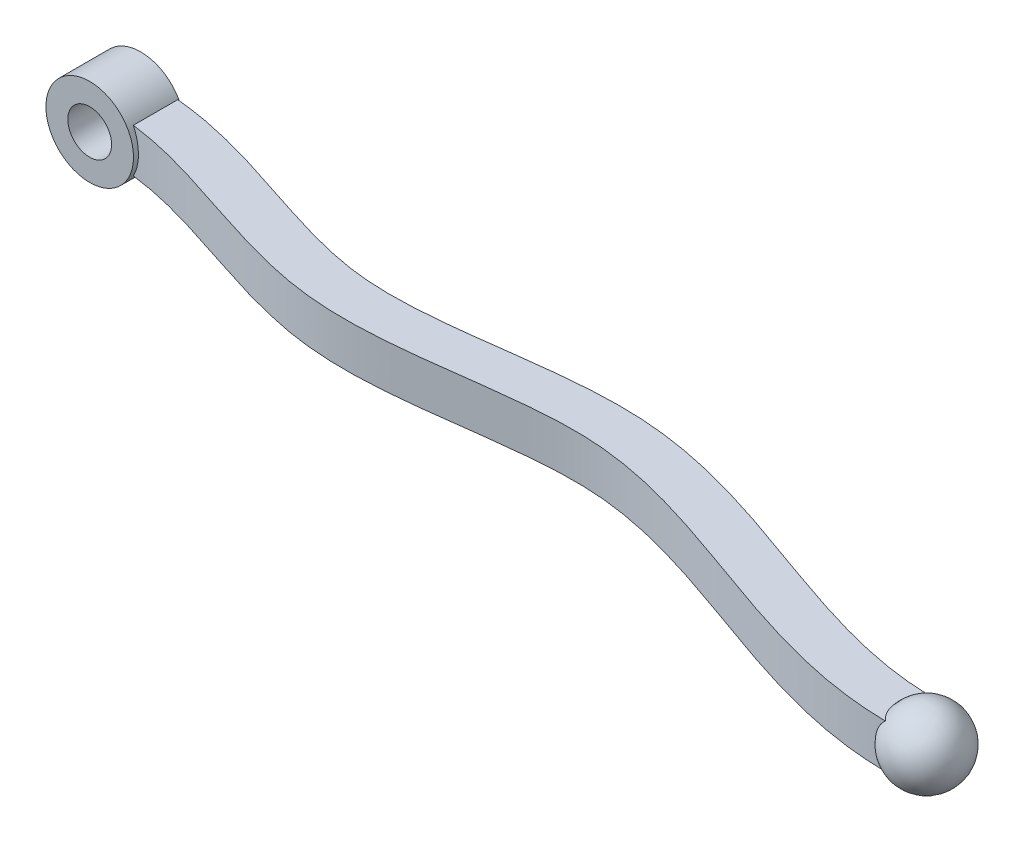
ISO-10303-21;
HEADER;
FILE_DESCRIPTION(('STEP AP214'),'2;1');
FILE_NAME('part.step','',(''),(''),'','','');
FILE_SCHEMA(('AUTOMOTIVE_DESIGN { 1 0 10303 214 1 1 1 1 }'));
ENDSEC;
DATA;
#1=APPLICATION_CONTEXT('core data for automotive mechanical design processes');
#2=APPLICATION_PROTOCOL_DEFINITION('international standard','automotive_design',2000,#1);
#3=PRODUCT_CONTEXT('',#1,'mechanical');
#4=PRODUCT('Part','Part','',(#3));
#5=PRODUCT_RELATED_PRODUCT_CATEGORY('part','',(#4));
#6=PRODUCT_DEFINITION_FORMATION('','',#4);
#7=PRODUCT_DEFINITION_CONTEXT('part definition',#1,'design');
#8=PRODUCT_DEFINITION('design','',#6,#7);
#9=PRODUCT_DEFINITION_SHAPE('','',#8);
#10=(LENGTH_UNIT() NAMED_UNIT(*) SI_UNIT(.MILLI.,.METRE.));
#11=(NAMED_UNIT(*) PLANE_ANGLE_UNIT() SI_UNIT($,.RADIAN.));
#12=(NAMED_UNIT(*) SI_UNIT($,.STERADIAN.) SOLID_ANGLE_UNIT());
#13=UNCERTAINTY_MEASURE_WITH_UNIT(LENGTH_MEASURE(1.E-05),#10,'distance_accuracy_value','');
#14=(GEOMETRIC_REPRESENTATION_CONTEXT(3) GLOBAL_UNCERTAINTY_ASSIGNED_CONTEXT((#13)) GLOBAL_UNIT_ASSIGNED_CONTEXT((#10,
#11,#12)) REPRESENTATION_CONTEXT('',''));
#15=CARTESIAN_POINT('',(0.,0.,0.));
#16=DIRECTION('',(0.,0.,1.));
#17=DIRECTION('',(1.,0.,0.));
#18=AXIS2_PLACEMENT_3D('',#15,#16,#17);
#19=CARTESIAN_POINT('',(0.,15.,35.));
#20=CARTESIAN_POINT('',(6.17517436119068,15.,34.731974317645));
#21=CARTESIAN_POINT('',(18.5152590668971,15.,35.0129620523412));
#22=CARTESIAN_POINT('',(37.170665590693,15.,37.5159365771395));
#23=CARTESIAN_POINT('',(56.0848541528443,15.,41.7258683164039));
#24=CARTESIAN_POINT('',(81.7128496258667,15.,49.0537300263205));
#25=CARTESIAN_POINT('',(108.020452626906,15.,58.038993524635));
#26=CARTESIAN_POINT('',(135.256646496752,15.,66.6168352504316));
#27=CARTESIAN_POINT('',(156.260387172786,15.,72.2743568299035));
#28=CARTESIAN_POINT('',(174.301613090213,15.,75.8428196764069));
#29=CARTESIAN_POINT('',(189.16582788812,15.,77.6735264325607));
#30=CARTESIAN_POINT('',(203.993330921939,15.,78.7259855332847));
#31=CARTESIAN_POINT('',(222.371445803012,15.,78.7967968973809));
#32=CARTESIAN_POINT('',(251.387993428798,15.,76.9754103970586));
#33=CARTESIAN_POINT('',(286.850532323347,15.,72.3875505012103));
#34=CARTESIAN_POINT('',(321.01038950864,15.,67.8884128099835));
#35=CARTESIAN_POINT('',(347.295858138639,15.,66.0380232053965));
#36=CARTESIAN_POINT('',(363.238954323608,15.,65.9212515464109));
#37=CARTESIAN_POINT('',(375.651284697129,15.,66.6337301279932));
#38=CARTESIAN_POINT('',(388.109822122064,15.,67.9093061522835));
#39=CARTESIAN_POINT('',(403.749690687974,15.,70.4723026037993));
#40=CARTESIAN_POINT('',(422.682260498997,15.,74.8769392581122));
#41=CARTESIAN_POINT('',(448.174732674391,15.,82.194518923164));
#42=CARTESIAN_POINT('',(480.555456963175,15.,93.408377778443));
#43=CARTESIAN_POINT('',(520.427662961586,15.,107.943611619436));
#44=CARTESIAN_POINT('',(554.767112986753,15.,118.972911004134));
#45=CARTESIAN_POINT('',(583.115711960437,15.,125.872568026111));
#46=CARTESIAN_POINT('',(604.860049285225,15.,129.74335851196));
#47=CARTESIAN_POINT('',(623.423539204423,15.,131.586992844284));
#48=CARTESIAN_POINT('',(638.512385714024,15.,132.052047052945));
#49=CARTESIAN_POINT('',(646.184378032833,15.,131.915612276124));
#50=CARTESIAN_POINT('',(650.,15.,131.750000000001));
#51=B_SPLINE_CURVE_WITH_KNOTS('',3,(#19,#20,#21,#22,#23,#24,#25,#26,#27,#28,#29,#30,#31,#32,#33,
#34,#35,#36,#37,#38,#39,#40,#41,#42,#43,#44,#45,#46,#47,#48,#49,#50),.UNSPECIFIED.,.F.,.F.,(4,1,
1,1,1,1,1,1,1,1,1,1,1,1,1,1,1,1,1,1,1,1,1,1,1,1,1,1,1,4),(0.,0.03125,0.0625,0.09375,0.125,
0.1875,0.21875,0.25,0.28125,0.296875,0.3125,0.34375,0.375,0.4375,0.5,0.53125,0.5625,0.578125,
0.59375,0.625,0.65625,0.6875,0.75,0.8125,0.875,0.90625,0.9375,0.96875,0.984375,1.),.UNSPECIFIED.);
#52=DIRECTION('',(0.,-1.,0.));
#53=VECTOR('',#52,1.);
#54=SURFACE_OF_LINEAR_EXTRUSION('',#51,#53);
#55=CARTESIAN_POINT('',(638.195924558769,15.9,131.95734842183));
#56=CARTESIAN_POINT('',(637.894570314862,15.6785446644378,131.954999735885));
#57=CARTESIAN_POINT('',(637.599257893205,15.4488649721107,131.95211635253));
#58=CARTESIAN_POINT('',(637.021613827236,14.9736697841532,131.945439108632));
#59=CARTESIAN_POINT('',(636.739283742276,14.7281523946691,131.941645139054));
#60=CARTESIAN_POINT('',(636.188565387513,14.2219400509218,131.933306146985));
#61=CARTESIAN_POINT('',(635.920177560876,13.9612446147703,131.928761100641));
#62=CARTESIAN_POINT('',(635.398126993235,13.4252709728365,131.919082994936));
#63=CARTESIAN_POINT('',(635.144471369269,13.1499858396722,131.913949654877));
#64=CARTESIAN_POINT('',(634.652901575116,12.585724987124,131.903263833395));
#65=CARTESIAN_POINT('',(634.414986609225,12.2967499610459,131.897711373188));
#66=CARTESIAN_POINT('',(633.955730408986,11.7059517471681,131.886354016619));
#67=CARTESIAN_POINT('',(633.73438892431,11.4041287535329,131.880549124071));
#68=CARTESIAN_POINT('',(633.202333112493,10.6340178862685,131.865915185896));
#69=CARTESIAN_POINT('',(632.902477519025,10.1581686808668,131.857029710133));
#70=CARTESIAN_POINT('',(632.344334183445,9.18257054460259,131.839589566832));
#71=CARTESIAN_POINT('',(632.086051090729,8.68281894863443,131.831034936375));
#72=CARTESIAN_POINT('',(631.731567268829,7.91821330210677,131.81881983755));
#73=CARTESIAN_POINT('',(631.618909935244,7.66088637833989,131.814851470979));
#74=CARTESIAN_POINT('',(631.40479035683,7.14169872020797,131.80717395411));
#75=CARTESIAN_POINT('',(631.303324978695,6.87983927864209,131.803464731368));
#76=CARTESIAN_POINT('',(631.015998370122,6.08800922344957,131.79280168816));
#77=CARTESIAN_POINT('',(630.847180054931,5.55172949864519,131.786311555705));
#78=CARTESIAN_POINT('',(630.558846250388,4.47496489770005,131.775009456908));
#79=CARTESIAN_POINT('',(630.438613357828,3.93467110930847,131.770173247125));
#80=CARTESIAN_POINT('',(630.244779876741,2.84574665500178,131.762288349299));
#81=CARTESIAN_POINT('',(630.171179001117,2.29711604043473,131.75923965025));
#82=CARTESIAN_POINT('',(630.071250662828,1.19546682234067,131.755084183748));
#83=CARTESIAN_POINT('',(630.044931455299,0.642447469488645,131.753977755405));
#84=CARTESIAN_POINT('',(630.039819655896,-0.463809329990071,131.753763550033));
#85=CARTESIAN_POINT('',(630.061026538549,-1.01704677413781,131.754655750907));
#86=CARTESIAN_POINT('',(630.150021520577,-2.11034716661921,131.758362078123));
#87=CARTESIAN_POINT('',(630.217017598074,-2.65047490029594,131.761143521006));
#88=CARTESIAN_POINT('',(630.3961987977,-3.72316399194545,131.768458272102));
#89=CARTESIAN_POINT('',(630.508383490362,-4.25572542177775,131.772991563664));
#90=CARTESIAN_POINT('',(630.776999294202,-5.30951905707487,131.783586064016));
#91=CARTESIAN_POINT('',(630.93342808363,-5.83075185547495,131.789647192631));
#92=CARTESIAN_POINT('',(631.289245455557,-6.85831339171597,131.802993858304));
#93=CARTESIAN_POINT('',(631.488633641488,-7.36464226708861,131.81027938406));
#94=CARTESIAN_POINT('',(631.929745721746,-8.36120713243635,131.825736584102));
#95=CARTESIAN_POINT('',(632.171655456075,-8.85136077357803,131.83391208571));
#96=CARTESIAN_POINT('',(632.695283629612,-9.80995244967019,131.850687226955));
#97=CARTESIAN_POINT('',(632.97700483602,-10.2783889721073,131.859286896049));
#98=CARTESIAN_POINT('',(633.577946676906,-11.1903377037503,131.876427910999));
#99=CARTESIAN_POINT('',(633.89715661922,-11.6338569665144,131.884969272753));
#100=CARTESIAN_POINT('',(634.570679602125,-12.4932751109805,131.901487990635));
#101=CARTESIAN_POINT('',(634.924983559343,-12.9091810935113,131.909465491795));
#102=CARTESIAN_POINT('',(635.51599545667,-13.5485604816921,131.921327285926));
#103=CARTESIAN_POINT('',(635.742253118456,-13.7817825370454,131.925561350362));
#104=CARTESIAN_POINT('',(636.20573006249,-14.2371324003574,131.933538419752));
#105=CARTESIAN_POINT('',(636.442949985765,-14.4592595579483,131.937281395941));
#106=CARTESIAN_POINT('',(636.927222130601,-14.8914771695121,131.94416090998));
#107=CARTESIAN_POINT('',(637.17425277143,-15.1015918048191,131.947298698667));
#108=CARTESIAN_POINT('',(637.677984156241,-15.5098619828727,131.952874231793));
#109=CARTESIAN_POINT('',(637.934684180431,-15.7080184129454,131.955312028225));
#110=CARTESIAN_POINT('',(638.195924558768,-15.8999999999999,131.95734842183));
#111=B_SPLINE_CURVE_WITH_KNOTS('',3,(#55,#56,#57,#58,#59,#60,#61,#62,#63,#64,#65,#66,#67,#68,
#69,#70,#71,#72,#73,#74,#75,#76,#77,#78,#79,#80,#81,#82,#83,#84,#85,#86,#87,#88,#89,#90,#91,#92,
#93,#94,#95,#96,#97,#98,#99,#100,#101,#102,#103,#104,#105,#106,#107,#108,#109,#110),
.UNSPECIFIED.,.F.,.F.,(4,2,2,2,2,2,2,2,2,2,2,2,2,2,2,2,2,2,2,2,2,2,2,2,2,2,2,4),(0.,
1.12181374258616,2.24376187993795,3.365745657502,4.48826702574124,5.61073160607074,
6.73317922920454,8.41863022886261,10.1042695956418,10.9468474937354,11.7891889012681,
13.4736825778844,15.1323046828638,16.7909165762189,18.4498180265452,20.1087011352737,
21.7395932272051,23.370469819684,25.0012608462818,26.632036819406,28.2701258208926,
29.9083287380829,31.5460655528978,33.1833795749493,34.1579492958617,35.1325760778366,
36.1051663375605,37.0776843399197),.UNSPECIFIED.);
#112=CARTESIAN_POINT('',(637.057786759856,15.,131.94572220257));
#113=VERTEX_POINT('',#112);
#114=CARTESIAN_POINT('',(637.057786759856,-15.,131.94572220257));
#115=VERTEX_POINT('',#114);
#116=EDGE_CURVE('E62',#113,#115,#111,.T.);
#117=ORIENTED_EDGE('',*,*,#116,.F.);
#118=CARTESIAN_POINT('',(25.9807621135333,15.,36.1067285157905));
#119=VERTEX_POINT('',#118);
#120=EDGE_CURVE('E110',#119,#113,#51,.T.);
#121=ORIENTED_EDGE('',*,*,#120,.F.);
#122=CARTESIAN_POINT('',(25.9807621135332,-15.,36.1067285157905));
#123=CARTESIAN_POINT('',(26.2600424669185,-14.5163057478586,36.1406430030905));
#124=CARTESIAN_POINT('',(26.5258169359242,-14.0247427012194,36.1735486600508));
#125=CARTESIAN_POINT('',(27.0295791276363,-13.0274208438923,36.2369019313054));
#126=CARTESIAN_POINT('',(27.2675666571903,-12.5216619345563,36.2673495285128));
#127=CARTESIAN_POINT('',(27.7149758685806,-11.4974974471056,36.3253457860622));
#128=CARTESIAN_POINT('',(27.92439757849,-10.9790918814201,36.3528944492531));
#129=CARTESIAN_POINT('',(28.3138101407129,-9.93176637046776,36.4046829057796));
#130=CARTESIAN_POINT('',(28.4938295469772,-9.40285719254405,36.428925905574));
#131=CARTESIAN_POINT('',(28.8241008736625,-8.33565605679289,36.4737978078332));
#132=CARTESIAN_POINT('',(28.9743535674217,-7.79736434311881,36.4944268041879));
#133=CARTESIAN_POINT('',(29.1770141017315,-6.98426018420462,36.5224439788053));
#134=CARTESIAN_POINT('',(29.2407805335059,-6.71228450416359,36.5312952237085));
#135=CARTESIAN_POINT('',(29.3607122925902,-6.16657563814604,36.5479961713417));
#136=CARTESIAN_POINT('',(29.4168759236238,-5.89284207418707,36.5558456505435));
#137=CARTESIAN_POINT('',(29.6262422926594,-4.79464675881536,36.585184249185));
#138=CARTESIAN_POINT('',(29.7487912970903,-3.96399306690303,36.6025439584604));
#139=CARTESIAN_POINT('',(29.9238453205679,-2.29511542531383,36.627411617618));
#140=CARTESIAN_POINT('',(29.9763412738478,-1.45689050995193,36.6349182923885));
#141=CARTESIAN_POINT('',(30.0022824114773,-0.198449946475774,36.6386267446416));
#142=CARTESIAN_POINT('',(30.0021201764792,0.221353423158035,36.6386030411668));
#143=CARTESIAN_POINT('',(29.9841857631644,1.06048110473102,36.6360402987322));
#144=CARTESIAN_POINT('',(29.9664185577586,1.47980551847481,36.6335019700836));
#145=CARTESIAN_POINT('',(29.9133081697708,2.3173417049751,36.6259284948699));
#146=CARTESIAN_POINT('',(29.8779639922161,2.73555341339766,36.6208932069605));
#147=CARTESIAN_POINT('',(29.789772769735,3.57009403284694,36.6083663339216));
#148=CARTESIAN_POINT('',(29.7369244564852,3.98642280522246,36.6008745708001));
#149=CARTESIAN_POINT('',(29.5527233362169,5.22826984291124,36.57486021498));
#150=CARTESIAN_POINT('',(29.395498636557,6.05003456719682,36.5527671871648));
#151=CARTESIAN_POINT('',(29.0130590422747,7.67732460945236,36.4997064342674));
#152=CARTESIAN_POINT('',(28.7878332635853,8.48284730573356,36.4687372885382));
#153=CARTESIAN_POINT('',(28.2715557079161,10.0704848065319,36.3989486249439));
#154=CARTESIAN_POINT('',(27.9806271391239,10.8526403606879,36.3601438150324));
#155=CARTESIAN_POINT('',(27.3349200916607,12.3893525648738,36.2758664289143));
#156=CARTESIAN_POINT('',(26.9801815007037,13.1439261039106,36.2303980214008));
#157=CARTESIAN_POINT('',(26.4964617990772,14.0706374898404,36.1700441204641));
#158=CARTESIAN_POINT('',(26.396028423211,14.2581542439639,36.1575918367282));
#159=CARTESIAN_POINT('',(26.1913011998839,14.6308187946159,36.132383973935));
#160=CARTESIAN_POINT('',(26.087011049422,14.8159686420169,36.1196286893173));
#161=CARTESIAN_POINT('',(25.9807621135332,15.,36.1067285157905));
#162=B_SPLINE_CURVE_WITH_KNOTS('',3,(#122,#123,#124,#125,#126,#127,#128,#129,#130,#131,#132,
#133,#134,#135,#136,#137,#138,#139,#140,#141,#142,#143,#144,#145,#146,#147,#148,#149,#150,#151,
#152,#153,#154,#155,#156,#157,#158,#159,#160,#161),.UNSPECIFIED.,.F.,.F.,(4,2,2,2,2,2,2,2,2,2,2,
2,2,2,2,2,2,2,2,4),(0.,1.67846265641959,3.35693697947034,5.03540965299053,6.71224246437918,
8.38903170599275,9.22740514876542,10.0659653355253,12.5821545085847,15.0986692773563,
16.3577615301984,17.6164982261069,18.8753061829416,20.1342053710725,22.6418581311087,
25.1499124721639,27.6533021090596,30.1551322783699,30.7943533277805,31.4329767597235),.UNSPECIFIED.);
#163=CARTESIAN_POINT('',(25.9807621135332,-15.,36.1067285157905));
#164=VERTEX_POINT('',#163);
#165=EDGE_CURVE('E205',#164,#119,#162,.T.);
#166=ORIENTED_EDGE('',*,*,#165,.F.);
#167=CARTESIAN_POINT('',(0.,-15.,35.));
#168=CARTESIAN_POINT('',(6.17517436119068,-15.,34.731974317645));
#169=CARTESIAN_POINT('',(18.5152590668971,-15.,35.0129620523412));
#170=CARTESIAN_POINT('',(37.170665590693,-15.,37.5159365771395));
#171=CARTESIAN_POINT('',(56.0848541528443,-15.,41.7258683164039));
#172=CARTESIAN_POINT('',(81.7128496258667,-15.,49.0537300263205));
#173=CARTESIAN_POINT('',(108.020452626906,-15.,58.038993524635));
#174=CARTESIAN_POINT('',(135.256646496752,-15.,66.6168352504316));
#175=CARTESIAN_POINT('',(156.260387172786,-15.,72.2743568299035));
#176=CARTESIAN_POINT('',(174.301613090213,-15.,75.8428196764069));
#177=CARTESIAN_POINT('',(189.16582788812,-15.,77.6735264325607));
#178=CARTESIAN_POINT('',(203.993330921939,-15.,78.7259855332847));
#179=CARTESIAN_POINT('',(222.371445803012,-15.,78.7967968973809));
#180=CARTESIAN_POINT('',(251.387993428798,-15.,76.9754103970586));
#181=CARTESIAN_POINT('',(286.850532323347,-15.,72.3875505012103));
#182=CARTESIAN_POINT('',(321.01038950864,-15.,67.8884128099835));
#183=CARTESIAN_POINT('',(347.295858138639,-15.,66.0380232053965));
#184=CARTESIAN_POINT('',(363.238954323608,-15.,65.9212515464109));
#185=CARTESIAN_POINT('',(375.651284697129,-15.,66.6337301279932));
#186=CARTESIAN_POINT('',(388.109822122064,-15.,67.9093061522835));
#187=CARTESIAN_POINT('',(403.749690687974,-15.,70.4723026037993));
#188=CARTESIAN_POINT('',(422.682260498997,-15.,74.8769392581122));
#189=CARTESIAN_POINT('',(448.174732674391,-15.,82.194518923164));
#190=CARTESIAN_POINT('',(480.555456963175,-15.,93.408377778443));
#191=CARTESIAN_POINT('',(520.427662961586,-15.,107.943611619436));
#192=CARTESIAN_POINT('',(554.767112986753,-15.,118.972911004134));
#193=CARTESIAN_POINT('',(583.115711960437,-15.,125.872568026111));
#194=CARTESIAN_POINT('',(604.860049285225,-15.,129.74335851196));
#195=CARTESIAN_POINT('',(623.423539204423,-15.,131.586992844284));
#196=CARTESIAN_POINT('',(638.512385714024,-15.,132.052047052945));
#197=CARTESIAN_POINT('',(646.184378032833,-15.,131.915612276124));
#198=CARTESIAN_POINT('',(650.,-15.,131.750000000001));
#199=B_SPLINE_CURVE_WITH_KNOTS('',3,(#167,#168,#169,#170,#171,#172,#173,#174,#175,#176,#177,
#178,#179,#180,#181,#182,#183,#184,#185,#186,#187,#188,#189,#190,#191,#192,#193,#194,#195,#196,
#197,#198),.UNSPECIFIED.,.F.,.F.,(4,1,1,1,1,1,1,1,1,1,1,1,1,1,1,1,1,1,1,1,1,1,1,1,1,1,1,1,1,4),
(0.,0.03125,0.0625,0.09375,0.125,0.1875,0.21875,0.25,0.28125,0.296875,0.3125,0.34375,0.375,
0.4375,0.5,0.53125,0.5625,0.578125,0.59375,0.625,0.65625,0.6875,0.75,0.8125,0.875,0.90625,
0.9375,0.96875,0.984375,1.),.UNSPECIFIED.);
#200=EDGE_CURVE('E176',#164,#115,#199,.T.);
#201=ORIENTED_EDGE('',*,*,#200,.T.);
#202=EDGE_LOOP('',(#117,#121,#166,#201));
#203=FACE_BOUND('',#202,.T.);
#204=ADVANCED_FACE('F45',(#203),#54,.F.);
#205=CARTESIAN_POINT('',(650.,15.,101.645600986954));
#206=CARTESIAN_POINT('',(637.304908079025,15.,102.198614127708));
#207=CARTESIAN_POINT('',(611.961966660842,15.,100.702697659403));
#208=CARTESIAN_POINT('',(573.746471613217,15.,92.4232624946312));
#209=CARTESIAN_POINT('',(534.986656329246,15.,80.0208852529893));
#210=CARTESIAN_POINT('',(495.533336135527,15.,65.6517545990787));
#211=CARTESIAN_POINT('',(461.8406449504,15.,53.9664032444759));
#212=CARTESIAN_POINT('',(434.195904051244,15.,46.0253650161031));
#213=CARTESIAN_POINT('',(413.061689707112,15.,41.1022594116242));
#214=CARTESIAN_POINT('',(395.071873906053,15.,38.1478984146111));
#215=CARTESIAN_POINT('',(380.44580655935,15.,36.6492663055852));
#216=CARTESIAN_POINT('',(365.637654212113,15.,35.8029319578208));
#217=CARTESIAN_POINT('',(347.305595948471,15.,35.9576427015315));
#218=CARTESIAN_POINT('',(318.359716957788,15.,38.0169478165207));
#219=CARTESIAN_POINT('',(282.993579374029,15.,42.7135458503671));
#220=CARTESIAN_POINT('',(248.949227637288,15.,47.0876882830236));
#221=CARTESIAN_POINT('',(222.771634236759,15.,48.717190130283));
#222=CARTESIAN_POINT('',(206.908721637667,15.,48.6449899003598));
#223=CARTESIAN_POINT('',(194.5454556685,15.,47.7651300553976));
#224=CARTESIAN_POINT('',(182.374300973214,15.,46.2692670501626));
#225=CARTESIAN_POINT('',(166.88986356671,15.,43.2308869532915));
#226=CARTESIAN_POINT('',(147.949320172853,15.,38.1438808523837));
#227=CARTESIAN_POINT('',(128.584292055798,15.,32.0578632299378));
#228=CARTESIAN_POINT('',(108.764383100192,15.,25.4668931458879));
#229=CARTESIAN_POINT('',(88.424967614641,15.,18.894482834777));
#230=CARTESIAN_POINT('',(67.4809703831505,15.,12.8952967356191));
#231=CARTESIAN_POINT('',(49.4404066907342,15.,8.86582134454765));
#232=CARTESIAN_POINT('',(34.6121293607649,15.,6.54300795782748));
#233=CARTESIAN_POINT('',(23.2888097383899,15.,5.33562969345408));
#234=CARTESIAN_POINT('',(13.6781997115335,15.,4.84661063966516));
#235=CARTESIAN_POINT('',(5.89915892978947,15.,4.80823512795033));
#236=CARTESIAN_POINT('',(1.9612196102356,15.,4.91456696626815));
#237=CARTESIAN_POINT('',(0.,15.,5.00000000000001));
#238=B_SPLINE_CURVE_WITH_KNOTS('',3,(#205,#206,#207,#208,#209,#210,#211,#212,#213,#214,#215,
#216,#217,#218,#219,#220,#221,#222,#223,#224,#225,#226,#227,#228,#229,#230,#231,#232,#233,#234,
#235,#236,#237),.UNSPECIFIED.,.F.,.F.,(4,1,1,1,1,1,1,1,1,1,1,1,1,1,1,1,1,1,1,1,1,1,1,1,1,1,1,1,
1,1,4),(0.,0.0625,0.125,0.1875,0.25,0.3125,0.34375,0.375,0.40625,0.421875,0.4375,0.46875,0.5,
0.5625,0.625,0.65625,0.6875,0.703125,0.71875,0.75,0.78125,0.8125,0.84375,0.875,0.90625,0.9375,
0.953125,0.96875,0.984375,0.9921875,1.),.UNSPECIFIED.);
#239=DIRECTION('',(0.,-1.,0.));
#240=VECTOR('',#239,1.);
#241=SURFACE_OF_LINEAR_EXTRUSION('',#238,#240);
#242=CARTESIAN_POINT('',(637.760346991548,-15.9000000000001,101.785359572129));
#243=CARTESIAN_POINT('',(637.4652960339,-15.6673688460433,101.779474376899));
#244=CARTESIAN_POINT('',(637.177049723113,-15.426138348757,101.773071405517));
#245=CARTESIAN_POINT('',(636.615066652741,-14.9274896373256,101.759440255247));
#246=CARTESIAN_POINT('',(636.341326208518,-14.6700755706487,101.752212287402));
#247=CARTESIAN_POINT('',(635.809123445311,-14.139970669624,101.737138831927));
#248=CARTESIAN_POINT('',(635.55065999228,-13.8672809721572,101.729293390235));
#249=CARTESIAN_POINT('',(635.050195324759,-13.3081126749239,101.713206379415));
#250=CARTESIAN_POINT('',(634.808164683517,-13.0216603807193,101.704965566032));
#251=CARTESIAN_POINT('',(634.340713535366,-12.4354932934009,101.688275319449));
#252=CARTESIAN_POINT('',(634.115293678613,-12.1357779818984,101.6798258781));
#253=CARTESIAN_POINT('',(633.681700931216,-11.524144498494,101.662913147587));
#254=CARTESIAN_POINT('',(633.473528175334,-11.2122262312718,101.654449858316));
#255=CARTESIAN_POINT('',(632.975511430471,-10.4187263707924,101.633512890465));
#256=CARTESIAN_POINT('',(632.696739494233,-9.93014037480882,101.621145070514));
#257=CARTESIAN_POINT('',(632.180795431577,-8.93135069659962,101.597368553699));
#258=CARTESIAN_POINT('',(631.943629570502,-8.42114377287611,101.585960001423));
#259=CARTESIAN_POINT('',(631.620127317878,-7.64247206575548,101.569944346536));
#260=CARTESIAN_POINT('',(631.51764673469,-7.38062287192483,101.564787540636));
#261=CARTESIAN_POINT('',(631.323598364566,-6.85298843550046,101.554894907303));
#262=CARTESIAN_POINT('',(631.232027509186,-6.58720432338892,101.550158961595));
#263=CARTESIAN_POINT('',(630.973817501249,-5.78446720265565,101.536656493038));
#264=CARTESIAN_POINT('',(630.823667893002,-5.24209805374647,101.52859468353));
#265=CARTESIAN_POINT('',(630.566099774394,-4.1376545885939,101.514571581978));
#266=CARTESIAN_POINT('',(630.45944803781,-3.57540211199044,101.508648177287));
#267=CARTESIAN_POINT('',(630.293126952645,-2.4439504944831,101.499339801761));
#268=CARTESIAN_POINT('',(630.233458112003,-1.87475127854465,101.495954858372));
#269=CARTESIAN_POINT('',(630.161432886875,-0.733321326022572,101.491862613471));
#270=CARTESIAN_POINT('',(630.14907990289,-0.161090374513191,101.49115550441));
#271=CARTESIAN_POINT('',(630.171759152294,0.98242963203713,101.492448038451));
#272=CARTESIAN_POINT('',(630.206791641354,1.55371868197936,101.494447696157));
#273=CARTESIAN_POINT('',(630.32494637734,2.70004610389728,101.501122773461));
#274=CARTESIAN_POINT('',(630.40878877992,3.27501025917333,101.505838251676));
#275=CARTESIAN_POINT('',(630.624637536048,4.41579253453209,101.517774197849));
#276=CARTESIAN_POINT('',(630.756644900091,4.98161046246812,101.524994718363));
#277=CARTESIAN_POINT('',(631.068168563803,6.10029174567934,101.541633712015));
#278=CARTESIAN_POINT('',(631.247702152671,6.65315030673319,101.551052984872));
#279=CARTESIAN_POINT('',(631.55173391515,7.46926116042059,101.566508477816));
#280=CARTESIAN_POINT('',(631.658869523951,7.73910855425768,101.571881557577));
#281=CARTESIAN_POINT('',(631.884604084419,8.2740464914771,101.583009303094));
#282=CARTESIAN_POINT('',(632.003206174287,8.53913570894935,101.588764073178));
#283=CARTESIAN_POINT('',(632.374574896397,9.32355381862869,101.606436042148));
#284=CARTESIAN_POINT('',(632.644038579188,9.83507814174331,101.618819828042));
#285=CARTESIAN_POINT('',(633.225937871157,10.8330486477607,101.6442401519));
#286=CARTESIAN_POINT('',(633.538372037022,11.3194956722172,101.657276667929));
#287=CARTESIAN_POINT('',(634.03744725881,12.0270530722737,101.676809551234));
#288=CARTESIAN_POINT('',(634.208766261318,12.2590895814735,101.683313032057));
#289=CARTESIAN_POINT('',(634.561290514781,12.7154315041464,101.696226541497));
#290=CARTESIAN_POINT('',(634.742493391106,12.9397387536505,101.702636592096));
#291=CARTESIAN_POINT('',(635.300418538578,13.6002739002054,101.721588987859));
#292=CARTESIAN_POINT('',(635.691676887063,14.0244266509386,101.73386237707));
#293=CARTESIAN_POINT('',(636.363361549196,14.6910234207122,101.752801681575));
#294=CARTESIAN_POINT('',(636.633303889992,14.9441460865533,101.759901753897));
#295=CARTESIAN_POINT('',(637.18675482326,15.4342506895755,101.773286673663));
#296=CARTESIAN_POINT('',(637.47024235658,15.6712563778603,101.779572733623));
#297=CARTESIAN_POINT('',(637.760346991548,15.9,101.785359572129));
#298=B_SPLINE_CURVE_WITH_KNOTS('',3,(#242,#243,#244,#245,#246,#247,#248,#249,#250,#251,#252,
#253,#254,#255,#256,#257,#258,#259,#260,#261,#262,#263,#264,#265,#266,#267,#268,#269,#270,#271,
#272,#273,#274,#275,#276,#277,#278,#279,#280,#281,#282,#283,#284,#285,#286,#287,#288,#289,#290,
#291,#292,#293,#294,#295,#296,#297),.UNSPECIFIED.,.F.,.F.,(4,2,2,2,2,2,2,2,2,2,2,2,2,2,2,2,2,2,
2,2,2,2,2,2,2,2,2,4),(0.,1.12714956763101,2.25401144161915,3.38078956061238,4.50549358797938,
5.63024161361205,6.75499842668408,8.44092657502901,10.1271083850988,10.9706081797588,
11.8138701708597,13.5002925994977,15.2152767289763,16.9302793991174,18.6454053209423,
20.3605404968237,22.1016467161483,23.8427894657366,25.5845664847465,26.4554987126734,
27.3266699798145,29.059295040955,30.7918619200919,31.6571246281069,32.522180361955,
34.2511521156282,35.3609824369833,36.4691401084031),.UNSPECIFIED.);
#299=CARTESIAN_POINT('',(636.699484910146,-15.,101.761392011363));
#300=VERTEX_POINT('',#299);
#301=CARTESIAN_POINT('',(636.699484910146,15.,101.761392011362));
#302=VERTEX_POINT('',#301);
#303=EDGE_CURVE('E114',#300,#302,#298,.T.);
#304=ORIENTED_EDGE('',*,*,#303,.F.);
#305=CARTESIAN_POINT('',(650.,-15.,101.645600986954));
#306=CARTESIAN_POINT('',(637.304908079025,-15.,102.198614127708));
#307=CARTESIAN_POINT('',(611.961966660842,-15.,100.702697659403));
#308=CARTESIAN_POINT('',(573.746471613217,-15.,92.4232624946312));
#309=CARTESIAN_POINT('',(534.986656329246,-15.,80.0208852529893));
#310=CARTESIAN_POINT('',(495.533336135527,-15.,65.6517545990787));
#311=CARTESIAN_POINT('',(461.8406449504,-15.,53.9664032444759));
#312=CARTESIAN_POINT('',(434.195904051244,-15.,46.0253650161031));
#313=CARTESIAN_POINT('',(413.061689707112,-15.,41.1022594116242));
#314=CARTESIAN_POINT('',(395.071873906053,-15.,38.1478984146111));
#315=CARTESIAN_POINT('',(380.44580655935,-15.,36.6492663055852));
#316=CARTESIAN_POINT('',(365.637654212113,-15.,35.8029319578208));
#317=CARTESIAN_POINT('',(347.305595948471,-15.,35.9576427015315));
#318=CARTESIAN_POINT('',(318.359716957788,-15.,38.0169478165207));
#319=CARTESIAN_POINT('',(282.993579374029,-15.,42.7135458503671));
#320=CARTESIAN_POINT('',(248.949227637288,-15.,47.0876882830236));
#321=CARTESIAN_POINT('',(222.771634236759,-15.,48.717190130283));
#322=CARTESIAN_POINT('',(206.908721637667,-15.,48.6449899003598));
#323=CARTESIAN_POINT('',(194.5454556685,-15.,47.7651300553976));
#324=CARTESIAN_POINT('',(182.374300973214,-15.,46.2692670501626));
#325=CARTESIAN_POINT('',(166.88986356671,-15.,43.2308869532915));
#326=CARTESIAN_POINT('',(147.949320172853,-15.,38.1438808523837));
#327=CARTESIAN_POINT('',(128.584292055798,-15.,32.0578632299378));
#328=CARTESIAN_POINT('',(108.764383100192,-15.,25.4668931458879));
#329=CARTESIAN_POINT('',(88.424967614641,-15.,18.894482834777));
#330=CARTESIAN_POINT('',(67.4809703831505,-15.,12.8952967356191));
#331=CARTESIAN_POINT('',(49.4404066907342,-15.,8.86582134454765));
#332=CARTESIAN_POINT('',(34.6121293607649,-15.,6.54300795782748));
#333=CARTESIAN_POINT('',(23.2888097383899,-15.,5.33562969345408));
#334=CARTESIAN_POINT('',(13.6781997115335,-15.,4.84661063966516));
#335=CARTESIAN_POINT('',(5.89915892978947,-15.,4.80823512795033));
#336=CARTESIAN_POINT('',(1.9612196102356,-15.,4.91456696626815));
#337=CARTESIAN_POINT('',(0.,-15.,5.00000000000001));
#338=B_SPLINE_CURVE_WITH_KNOTS('',3,(#305,#306,#307,#308,#309,#310,#311,#312,#313,#314,#315,
#316,#317,#318,#319,#320,#321,#322,#323,#324,#325,#326,#327,#328,#329,#330,#331,#332,#333,#334,
#335,#336,#337),.UNSPECIFIED.,.F.,.F.,(4,1,1,1,1,1,1,1,1,1,1,1,1,1,1,1,1,1,1,1,1,1,1,1,1,1,1,1,
1,1,4),(0.,0.0625,0.125,0.1875,0.25,0.3125,0.34375,0.375,0.40625,0.421875,0.4375,0.46875,0.5,
0.5625,0.625,0.65625,0.6875,0.703125,0.71875,0.75,0.78125,0.8125,0.84375,0.875,0.90625,0.9375,
0.953125,0.96875,0.984375,0.9921875,1.),.UNSPECIFIED.);
#339=CARTESIAN_POINT('',(25.9807621135271,-15.,5.67113011177059));
#340=VERTEX_POINT('',#339);
#341=EDGE_CURVE('E101',#300,#340,#338,.T.);
#342=ORIENTED_EDGE('',*,*,#341,.T.);
#343=CARTESIAN_POINT('',(25.9807621135332,15.,5.67113011177115));
#344=CARTESIAN_POINT('',(26.2609201280199,14.5147862441208,5.69681695930332));
#345=CARTESIAN_POINT('',(26.5274713169688,14.0216809546091,5.72181047267467));
#346=CARTESIAN_POINT('',(27.0325819166685,13.0212607791852,5.77003650164683));
#347=CARTESIAN_POINT('',(27.2711416956585,12.5139460803127,5.79326904041262));
#348=CARTESIAN_POINT('',(27.7194972916578,11.4866710735737,5.83759934103686));
#349=CARTESIAN_POINT('',(27.9292932972006,10.9667108486193,5.85869711688749));
#350=CARTESIAN_POINT('',(28.3192473818405,9.9163366261192,5.89840914444824));
#351=CARTESIAN_POINT('',(28.4994366459891,9.3859342956114,5.9170260053708));
#352=CARTESIAN_POINT('',(28.829871042191,8.31577409639835,5.95151483412371));
#353=CARTESIAN_POINT('',(28.9801167965508,7.77601642237575,5.96738685899821));
#354=CARTESIAN_POINT('',(29.1826403821344,6.96074200415965,5.98895195066612));
#355=CARTESIAN_POINT('',(29.2463401276088,6.68804742166301,5.99576642399097));
#356=CARTESIAN_POINT('',(29.366097301394,6.14091117376665,6.00862511677635));
#357=CARTESIAN_POINT('',(29.4221530311149,5.86646913419646,6.01466916501998));
#358=CARTESIAN_POINT('',(29.6309919822168,4.7655435204635,6.03725486619826));
#359=CARTESIAN_POINT('',(29.7529678979348,3.9329135569814,6.05061131164177));
#360=CARTESIAN_POINT('',(29.9265553136783,2.26018819059718,6.06968018420578));
#361=CARTESIAN_POINT('',(29.9781576453884,1.42009182931529,6.07539161532713));
#362=CARTESIAN_POINT('',(30.0025309381245,0.158891005021796,6.0780883820957));
#363=CARTESIAN_POINT('',(30.0018071388256,-0.261837632112026,6.07800781574621));
#364=CARTESIAN_POINT('',(29.9826723947467,-1.10279240109054,6.07589197029269));
#365=CARTESIAN_POINT('',(29.9642664379861,-1.52301864118649,6.0738572424447));
#366=CARTESIAN_POINT('',(29.909801528139,-2.36233657912095,6.0678495247645));
#367=CARTESIAN_POINT('',(29.8737415644336,-2.78142821062656,6.06387642396847));
#368=CARTESIAN_POINT('',(29.7840413825879,-3.61770718846685,6.05402738161622));
#369=CARTESIAN_POINT('',(29.7303998867725,-4.03489439416946,6.04815130176817));
#370=CARTESIAN_POINT('',(29.5434965249381,-5.28068860771153,6.02776669129689));
#371=CARTESIAN_POINT('',(29.3841278034788,-6.10549379433558,6.01048735263989));
#372=CARTESIAN_POINT('',(28.9968449112343,-7.73871167120137,5.96911379319541));
#373=CARTESIAN_POINT('',(28.7689194844889,-8.54712164631771,5.9450184533637));
#374=CARTESIAN_POINT('',(28.2467093270299,-10.1402557434806,5.89089761848344));
#375=CARTESIAN_POINT('',(27.9525540225604,-10.925022722014,5.86088370351588));
#376=CARTESIAN_POINT('',(27.2998516786863,-12.4666780467258,5.79594695890807));
#377=CARTESIAN_POINT('',(26.9413457446435,-13.2235838200725,5.7610272660166));
#378=CARTESIAN_POINT('',(26.4601987394405,-14.1384893424486,5.71560930306435));
#379=CARTESIAN_POINT('',(26.3666410503221,-14.3122045524937,5.70683793111905));
#380=CARTESIAN_POINT('',(26.1762035431874,-14.6575983828387,5.68911596487903));
#381=CARTESIAN_POINT('',(26.0793266756542,-14.8292786382178,5.68016553255623));
#382=CARTESIAN_POINT('',(25.9807621135331,-15.,5.67113011177115));
#383=B_SPLINE_CURVE_WITH_KNOTS('',3,(#343,#344,#345,#346,#347,#348,#349,#350,#351,#352,#353,
#354,#355,#356,#357,#358,#359,#360,#361,#362,#363,#364,#365,#366,#367,#368,#369,#370,#371,#372,
#373,#374,#375,#376,#377,#378,#379,#380,#381,#382),.UNSPECIFIED.,.F.,.F.,(4,2,2,2,2,2,2,2,2,2,2,
2,2,2,2,2,2,2,2,4),(0.,1.68240262803923,3.36478312085242,5.04715258588516,6.72773847555289,
8.4082894344879,9.24854534613474,10.0889876693051,12.6105741289682,15.1324890711554,
16.3943593889837,17.6558738460529,18.9174605280631,20.1791389117146,22.6966051983669,
25.2144850402293,27.7274865092947,30.238888419913,30.8313727180098,31.423343354159),.UNSPECIFIED.);
#384=CARTESIAN_POINT('',(25.9807621135271,15.,5.67113011177059));
#385=VERTEX_POINT('',#384);
#386=EDGE_CURVE('E206',#385,#340,#383,.T.);
#387=ORIENTED_EDGE('',*,*,#386,.F.);
#388=EDGE_CURVE('E116',#302,#385,#238,.T.);
#389=ORIENTED_EDGE('',*,*,#388,.F.);
#390=EDGE_LOOP('',(#304,#342,#387,#389));
#391=FACE_BOUND('',#390,.T.);
#392=ADVANCED_FACE('F115',(#391),#241,.F.);
#393=CARTESIAN_POINT('',(325.650600782432,15.,37.6436193137807));
#394=DIRECTION('',(0.,1.,0.));
#395=DIRECTION('',(0.,0.,1.));
#396=AXIS2_PLACEMENT_3D('',#393,#394,#395);
#397=PLANE('',#396);
#398=ORIENTED_EDGE('',*,*,#120,.T.);
#399=CARTESIAN_POINT('',(650.,15.,116.697800493477));
#400=DIRECTION('',(0.,1.,0.));
#401=DIRECTION('',(0.,0.,1.));
#402=AXIS2_PLACEMENT_3D('',#399,#400,#401);
#403=CIRCLE('',#402,20.);
#404=EDGE_CURVE('E69',#113,#302,#403,.F.);
#405=ORIENTED_EDGE('',*,*,#404,.T.);
#406=ORIENTED_EDGE('',*,*,#388,.T.);
#407=DIRECTION('',(0.,0.,-1.));
#408=VECTOR('',#407,1.);
#409=CARTESIAN_POINT('',(25.9807621135332,15.,40.));
#410=LINE('',#409,#408);
#411=EDGE_CURVE('E183',#385,#119,#410,.F.);
#412=ORIENTED_EDGE('',*,*,#411,.T.);
#413=EDGE_LOOP('',(#398,#405,#406,#412));
#414=FACE_BOUND('',#413,.T.);
#415=ADVANCED_FACE('F160',(#414),#397,.T.);
#416=CARTESIAN_POINT('',(325.650600782432,-15.,37.6436193137807));
#417=DIRECTION('',(0.,1.,0.));
#418=DIRECTION('',(0.,0.,1.));
#419=AXIS2_PLACEMENT_3D('',#416,#417,#418);
#420=PLANE('',#419);
#421=CARTESIAN_POINT('',(650.,-15.,116.697800493477));
#422=DIRECTION('',(0.,1.,0.));
#423=DIRECTION('',(0.,0.,1.));
#424=AXIS2_PLACEMENT_3D('',#421,#422,#423);
#425=CIRCLE('',#424,20.);
#426=EDGE_CURVE('E11',#115,#300,#425,.F.);
#427=ORIENTED_EDGE('',*,*,#426,.F.);
#428=ORIENTED_EDGE('',*,*,#200,.F.);
#429=DIRECTION('',(0.,0.,-1.));
#430=VECTOR('',#429,1.);
#431=CARTESIAN_POINT('',(25.9807621135332,-15.,40.));
#432=LINE('',#431,#430);
#433=EDGE_CURVE('E105',#340,#164,#432,.F.);
#434=ORIENTED_EDGE('',*,*,#433,.F.);
#435=ORIENTED_EDGE('',*,*,#341,.F.);
#436=EDGE_LOOP('',(#427,#428,#434,#435));
#437=FACE_BOUND('',#436,.T.);
#438=ADVANCED_FACE('F103',(#437),#420,.F.);
#439=CARTESIAN_POINT('',(0.,0.,40.));
#440=DIRECTION('',(0.,0.,-1.));
#441=DIRECTION('',(-1.,0.,0.));
#442=AXIS2_PLACEMENT_3D('',#439,#440,#441);
#443=CYLINDRICAL_SURFACE('',#442,30.);
#444=ORIENTED_EDGE('',*,*,#411,.F.);
#445=ORIENTED_EDGE('',*,*,#386,.T.);
#446=ORIENTED_EDGE('',*,*,#433,.T.);
#447=ORIENTED_EDGE('',*,*,#165,.T.);
#448=EDGE_LOOP('',(#444,#445,#446,#447));
#449=FACE_BOUND('',#448,.T.);
#450=CARTESIAN_POINT('',(0.,0.,40.));
#451=DIRECTION('',(0.,0.,1.));
#452=DIRECTION('',(1.,0.,0.));
#453=AXIS2_PLACEMENT_3D('',#450,#451,#452);
#454=CIRCLE('',#453,30.);
#455=CARTESIAN_POINT('',(30.,0.,40.));
#456=VERTEX_POINT('',#455);
#457=EDGE_CURVE('E319',#456,#456,#454,.T.);
#458=ORIENTED_EDGE('',*,*,#457,.F.);
#459=EDGE_LOOP('',(#458));
#460=FACE_BOUND('',#459,.T.);
#461=CARTESIAN_POINT('',(0.,0.,5.));
#462=DIRECTION('',(0.,0.,1.));
#463=DIRECTION('',(1.,0.,0.));
#464=AXIS2_PLACEMENT_3D('',#461,#462,#463);
#465=CIRCLE('',#464,30.);
#466=CARTESIAN_POINT('',(30.,0.,5.));
#467=VERTEX_POINT('',#466);
#468=EDGE_CURVE('E322',#467,#467,#465,.T.);
#469=ORIENTED_EDGE('',*,*,#468,.T.);
#470=EDGE_LOOP('',(#469));
#471=FACE_BOUND('',#470,.T.);
#472=ADVANCED_FACE('F202',(#449,#460,#471),#443,.T.);
#473=CARTESIAN_POINT('',(0.,0.,40.));
#474=DIRECTION('',(0.,0.,1.));
#475=DIRECTION('',(1.,0.,0.));
#476=AXIS2_PLACEMENT_3D('',#473,#474,#475);
#477=PLANE('',#476);
#478=CARTESIAN_POINT('',(0.,0.,40.));
#479=DIRECTION('',(0.,0.,1.));
#480=DIRECTION('',(1.,0.,0.));
#481=AXIS2_PLACEMENT_3D('',#478,#479,#480);
#482=CIRCLE('',#481,15.);
#483=CARTESIAN_POINT('',(15.,0.,40.));
#484=VERTEX_POINT('',#483);
#485=EDGE_CURVE('E124',#484,#484,#482,.T.);
#486=ORIENTED_EDGE('',*,*,#485,.F.);
#487=EDGE_LOOP('',(#486));
#488=FACE_BOUND('',#487,.T.);
#489=ORIENTED_EDGE('',*,*,#457,.T.);
#490=EDGE_LOOP('',(#489));
#491=FACE_BOUND('',#490,.T.);
#492=ADVANCED_FACE('F146',(#488,#491),#477,.T.);
#493=CARTESIAN_POINT('',(0.,0.,5.));
#494=DIRECTION('',(0.,0.,1.));
#495=DIRECTION('',(1.,0.,0.));
#496=AXIS2_PLACEMENT_3D('',#493,#494,#495);
#497=PLANE('',#496);
#498=DIRECTION('',(1.,0.,0.));
#499=VECTOR('',#498,1.);
#500=CARTESIAN_POINT('',(325.650600782432,15.,5.));
#501=LINE('',#500,#499);
#502=CARTESIAN_POINT('',(0.,15.,5.));
#503=VERTEX_POINT('',#502);
#504=CARTESIAN_POINT('',(16.0001891386205,15.,5.));
#505=VERTEX_POINT('',#504);
#506=EDGE_CURVE('E208',#503,#505,#501,.T.);
#507=ORIENTED_EDGE('',*,*,#506,.F.);
#508=CARTESIAN_POINT('',(0.,0.,5.));
#509=DIRECTION('',(0.,0.,1.));
#510=DIRECTION('',(1.,0.,0.));
#511=AXIS2_PLACEMENT_3D('',#508,#509,#510);
#512=CIRCLE('',#511,15.);
#513=CARTESIAN_POINT('',(0.,-15.,5.00000000000001));
#514=VERTEX_POINT('',#513);
#515=EDGE_CURVE('E317',#503,#514,#512,.T.);
#516=ORIENTED_EDGE('',*,*,#515,.T.);
#517=DIRECTION('',(1.,0.,0.));
#518=VECTOR('',#517,1.);
#519=CARTESIAN_POINT('',(325.650600782432,-15.,5.));
#520=LINE('',#519,#518);
#521=CARTESIAN_POINT('',(16.0001891386205,-15.,5.));
#522=VERTEX_POINT('',#521);
#523=EDGE_CURVE('E170',#514,#522,#520,.T.);
#524=ORIENTED_EDGE('',*,*,#523,.T.);
#525=DIRECTION('',(0.,-1.,0.));
#526=VECTOR('',#525,1.);
#527=CARTESIAN_POINT('',(16.0001891386205,15.,5.));
#528=LINE('',#527,#526);
#529=EDGE_CURVE('E212',#522,#505,#528,.F.);
#530=ORIENTED_EDGE('',*,*,#529,.T.);
#531=EDGE_LOOP('',(#507,#516,#524,#530));
#532=FACE_BOUND('',#531,.T.);
#533=ORIENTED_EDGE('',*,*,#468,.F.);
#534=EDGE_LOOP('',(#533));
#535=FACE_BOUND('',#534,.T.);
#536=ADVANCED_FACE('F226',(#532,#535),#497,.F.);
#537=EDGE_CURVE('E171',#505,#503,#238,.T.);
#538=ORIENTED_EDGE('',*,*,#537,.T.);
#539=ORIENTED_EDGE('',*,*,#506,.T.);
#540=EDGE_LOOP('',(#538,#539));
#541=FACE_BOUND('',#540,.T.);
#542=ADVANCED_FACE('F229',(#541),#397,.T.);
#543=ORIENTED_EDGE('',*,*,#523,.F.);
#544=EDGE_CURVE('E111',#522,#514,#338,.T.);
#545=ORIENTED_EDGE('',*,*,#544,.F.);
#546=EDGE_LOOP('',(#543,#545));
#547=FACE_BOUND('',#546,.T.);
#548=ADVANCED_FACE('F233',(#547),#420,.F.);
#549=ORIENTED_EDGE('',*,*,#544,.T.);
#550=CARTESIAN_POINT('',(0.,-15.,5.00000000000001));
#551=CARTESIAN_POINT('',(0.280294998901371,-15.0000090734628,4.98778747643873));
#552=CARTESIAN_POINT('',(0.560618543562536,-14.9921437979624,4.97624469461072));
#553=CARTESIAN_POINT('',(1.12042496650265,-14.9607207182049,4.9545053232314));
#554=CARTESIAN_POINT('',(1.39990788061953,-14.9371635927312,4.94430867547313));
#555=CARTESIAN_POINT('',(1.95715524002988,-14.8744134739671,4.92526737538912));
#556=CARTESIAN_POINT('',(2.23491971267157,-14.8352207301639,4.91642270149392));
#557=CARTESIAN_POINT('',(2.7876411776386,-14.7413558491576,4.90007991901653));
#558=CARTESIAN_POINT('',(3.06260015034412,-14.6866955454087,4.8925807881661));
#559=CARTESIAN_POINT('',(3.60905616182583,-14.5620480524366,4.87889704941203));
#560=CARTESIAN_POINT('',(3.88055324241711,-14.4920610485258,4.87271242561674));
#561=CARTESIAN_POINT('',(4.41920668518832,-14.3369865448974,4.86162053403051));
#562=CARTESIAN_POINT('',(4.68636307599447,-14.251899144809,4.85671325781246));
#563=CARTESIAN_POINT('',(5.34796735152335,-14.0205579913183,4.84597874031567));
#564=CARTESIAN_POINT('',(5.73921749578086,-13.8650022194859,4.84091988571088));
#565=CARTESIAN_POINT('',(6.50729716082194,-13.5215433600874,4.83335419633648));
#566=CARTESIAN_POINT('',(6.88412475829883,-13.3336359765431,4.83084770080128));
#567=CARTESIAN_POINT('',(7.62057772625131,-12.9268591797905,4.82810174424638));
#568=CARTESIAN_POINT('',(7.98020736056138,-12.7079974947936,4.82786171837865));
#569=CARTESIAN_POINT('',(8.67979792851629,-12.2408346175087,4.82931649100892));
#570=CARTESIAN_POINT('',(9.01975894275862,-11.9925335458693,4.83101128157791));
#571=CARTESIAN_POINT('',(9.67777509120971,-11.4681190684776,4.83597115220523));
#572=CARTESIAN_POINT('',(9.99581910780602,-11.1919917199108,4.83923702260282));
#573=CARTESIAN_POINT('',(10.6075620313513,-10.6139864887049,4.84695211297652));
#574=CARTESIAN_POINT('',(10.9012608899134,-10.3121085548881,4.8514013353045));
#575=CARTESIAN_POINT('',(11.4622825740444,-9.68468928226998,4.86108856729793));
#576=CARTESIAN_POINT('',(11.7296011415475,-9.35914413800316,4.86632670395915));
#577=CARTESIAN_POINT('',(12.2359196652695,-8.68673662348976,4.877201424194));
#578=CARTESIAN_POINT('',(12.4749195989968,-8.33987423631259,4.88283800808409));
#579=CARTESIAN_POINT('',(12.9233141551694,-7.62664456825365,4.89414806941126));
#580=CARTESIAN_POINT('',(13.1326548808308,-7.26024340256628,4.89982159490295));
#581=CARTESIAN_POINT('',(13.5197351612071,-6.5111074769618,4.91084973382376));
#582=CARTESIAN_POINT('',(13.6974746752624,-6.12837269602985,4.91620434684256));
#583=CARTESIAN_POINT('',(14.0200787716247,-5.34931134386908,4.92628712813987));
#584=CARTESIAN_POINT('',(14.1649455021901,-4.95298566276428,4.93101533734587));
#585=CARTESIAN_POINT('',(14.4207879044695,-4.14953297788606,4.93958609756861));
#586=CARTESIAN_POINT('',(14.5317635913574,-3.74240597894876,4.94342864898188));
#587=CARTESIAN_POINT('',(14.7190518932876,-2.92016060535987,4.95002426937783));
#588=CARTESIAN_POINT('',(14.7953575373757,-2.50504064107203,4.95277711924466));
#589=CARTESIAN_POINT('',(14.9127281762196,-1.66984178046681,4.95704875279094));
#590=CARTESIAN_POINT('',(14.9537931605538,-1.24976288268299,4.95856753610546));
#591=CARTESIAN_POINT('',(15.0003894594661,-0.407627706939351,4.96029288726242));
#592=CARTESIAN_POINT('',(15.0059200573954,0.0144286107288069,4.9604994286399));
#593=CARTESIAN_POINT('',(14.9814061213631,0.857505244989658,4.95958964518748));
#594=CARTESIAN_POINT('',(14.9513616043624,1.27852556207618,4.95847332098828));
#595=CARTESIAN_POINT('',(14.855942590557,2.11626702404689,4.95497624610224));
#596=CARTESIAN_POINT('',(14.7905905305351,2.53299072808905,4.95259629842314));
#597=CARTESIAN_POINT('',(14.6250372208093,3.35944883412436,4.94669577739265));
#598=CARTESIAN_POINT('',(14.5248359852031,3.76918323894487,4.94317520450269));
#599=CARTESIAN_POINT('',(14.2902982291613,4.57875304544114,4.93517921450594));
#600=CARTESIAN_POINT('',(14.155961718741,4.97858845002121,4.93070379767929));
#601=CARTESIAN_POINT('',(13.8541089811989,5.76552339714291,4.92104097876014));
#602=CARTESIAN_POINT('',(13.6865927385092,6.15262293370883,4.91585357633357));
#603=CARTESIAN_POINT('',(13.3195020031233,6.91148234872565,4.9050576114911));
#604=CARTESIAN_POINT('',(13.1199156085322,7.28323646754537,4.89944889312928));
#605=CARTESIAN_POINT('',(12.6901456629285,8.00861551851062,4.88814663292954));
#606=CARTESIAN_POINT('',(12.4599620926726,8.36224043925418,4.88245309103828));
#607=CARTESIAN_POINT('',(11.9706400877705,9.04883870884063,4.87134742830223));
#608=CARTESIAN_POINT('',(11.7115028177736,9.38181288751302,4.86593529615068));
#609=CARTESIAN_POINT('',(11.1661033570393,10.0247616610817,4.855779342541));
#610=CARTESIAN_POINT('',(10.879841212564,10.3347362952026,4.85103551994307));
#611=CARTESIAN_POINT('',(10.2821385195912,10.929567451438,4.84261230804658));
#612=CARTESIAN_POINT('',(9.97069099845037,11.2144169716431,4.83893321482111));
#613=CARTESIAN_POINT('',(9.32489652268099,11.7568760310237,4.83303477359657));
#614=CARTESIAN_POINT('',(8.9905493902881,12.0144853587005,4.83081543693067));
#615=CARTESIAN_POINT('',(8.30123159372598,12.5006999438292,4.82821265858789));
#616=CARTESIAN_POINT('',(7.94625466145021,12.7292963181769,4.8278297778781));
#617=CARTESIAN_POINT('',(7.21831392939934,13.1557545694236,4.82924712502057));
#618=CARTESIAN_POINT('',(6.84535069437363,13.3536174104982,4.83104728437065));
#619=CARTESIAN_POINT('',(6.08437689779893,13.7170705099465,4.83713172089192));
#620=CARTESIAN_POINT('',(5.69637767972237,13.8826845503252,4.84141415815804));
#621=CARTESIAN_POINT('',(4.90784697340592,14.1806441814219,4.85270158641075));
#622=CARTESIAN_POINT('',(4.50731557352715,14.3129900066461,4.85970655820545));
#623=CARTESIAN_POINT('',(3.69710657893434,14.5433343845981,4.87660194729817));
#624=CARTESIAN_POINT('',(3.28744103635381,14.6413756430364,4.88648874868652));
#625=CARTESIAN_POINT('',(2.46155976446649,14.8026218755709,4.9092599281055));
#626=CARTESIAN_POINT('',(2.04534729883863,14.8658436745686,4.92214285410902));
#627=CARTESIAN_POINT('',(1.35689008260305,14.9409805885888,4.9458623204177));
#628=CARTESIAN_POINT('',(1.08568949451473,14.9631290000481,4.95581586181948));
#629=CARTESIAN_POINT('',(0.542992558451497,14.9926282914915,4.97697151005734));
#630=CARTESIAN_POINT('',(0.271497479697347,15.0000040529682,4.98817148388278));
#631=CARTESIAN_POINT('',(0.,15.,5.00000000000001));
#632=B_SPLINE_CURVE_WITH_KNOTS('',3,(#550,#551,#552,#553,#554,#555,#556,#557,#558,#559,#560,
#561,#562,#563,#564,#565,#566,#567,#568,#569,#570,#571,#572,#573,#574,#575,#576,#577,#578,#579,
#580,#581,#582,#583,#584,#585,#586,#587,#588,#589,#590,#591,#592,#593,#594,#595,#596,#597,#598,
#599,#600,#601,#602,#603,#604,#605,#606,#607,#608,#609,#610,#611,#612,#613,#614,#615,#616,#617,
#618,#619,#620,#621,#622,#623,#624,#625,#626,#627,#628,#629,#630,#631),.UNSPECIFIED.,.F.,.F.,(4,
2,2,2,2,2,2,2,2,2,2,2,2,2,2,2,2,2,2,2,2,2,2,2,2,2,2,2,2,2,2,2,2,2,2,2,2,2,2,2,4),(0.,
0.841570768210335,1.68310513489567,2.52462607430291,3.365504940803,4.2063736409583,
5.04723679345346,6.30885826888932,7.57064740473393,8.83212207004039,10.0935915657468,
11.355696314399,12.6178035714676,13.880114214304,15.142425859707,16.4070027406824,
17.6715812487126,18.9360770918794,20.200572368898,21.4653217800784,22.7300715652755,
23.9948468575514,25.2596215468306,26.5235934571017,27.7875648560487,29.051535884148,
30.3155075052994,31.5799493004364,32.8443918908068,34.1087836378457,35.3731732284731,
36.6379140753412,37.9026647412087,39.1678017154585,40.4328989916814,41.6970597539944,
42.96121160505,44.223784068634,45.4857459157186,46.3022272590169,47.1173322469437),.UNSPECIFIED.);
#633=EDGE_CURVE('E55',#514,#503,#632,.T.);
#634=ORIENTED_EDGE('',*,*,#633,.T.);
#635=ORIENTED_EDGE('',*,*,#537,.F.);
#636=ORIENTED_EDGE('',*,*,#529,.F.);
#637=EDGE_LOOP('',(#549,#634,#635,#636));
#638=FACE_BOUND('',#637,.T.);
#639=ADVANCED_FACE('F144',(#638),#241,.F.);
#640=CARTESIAN_POINT('',(0.,0.,4.80823512795032));
#641=DIRECTION('',(0.,0.,1.));
#642=DIRECTION('',(1.,0.,0.));
#643=AXIS2_PLACEMENT_3D('',#640,#641,#642);
#644=CYLINDRICAL_SURFACE('',#643,15.);
#645=ORIENTED_EDGE('',*,*,#485,.T.);
#646=EDGE_LOOP('',(#645));
#647=FACE_BOUND('',#646,.T.);
#648=ORIENTED_EDGE('',*,*,#633,.F.);
#649=ORIENTED_EDGE('',*,*,#515,.F.);
#650=EDGE_LOOP('',(#648,#649));
#651=FACE_BOUND('',#650,.T.);
#652=ADVANCED_FACE('F139',(#647,#651),#644,.F.);
#653=CARTESIAN_POINT('',(650.,0.,116.697800493477));
#654=DIRECTION('',(0.,0.,-1.));
#655=DIRECTION('',(1.,0.,0.));
#656=AXIS2_PLACEMENT_3D('',#653,#654,#655);
#657=SPHERICAL_SURFACE('',#656,25.);
#658=ORIENTED_EDGE('',*,*,#404,.F.);
#659=ORIENTED_EDGE('',*,*,#116,.T.);
#660=ORIENTED_EDGE('',*,*,#426,.T.);
#661=ORIENTED_EDGE('',*,*,#303,.T.);
#662=EDGE_LOOP('',(#658,#659,#660,#661));
#663=FACE_BOUND('',#662,.T.);
#664=ADVANCED_FACE('F120',(#663),#657,.T.);
#665=CLOSED_SHELL('',(#204,#392,#415,#438,#472,#492,#536,#542,#548,#639,#652,#664));
#666=MANIFOLD_SOLID_BREP('B2',#665);
#667=ADVANCED_BREP_SHAPE_REPRESENTATION('',(#18,#666),#14);
#668=SHAPE_DEFINITION_REPRESENTATION(#9,#667);
ENDSEC;
END-ISO-10303-21;
